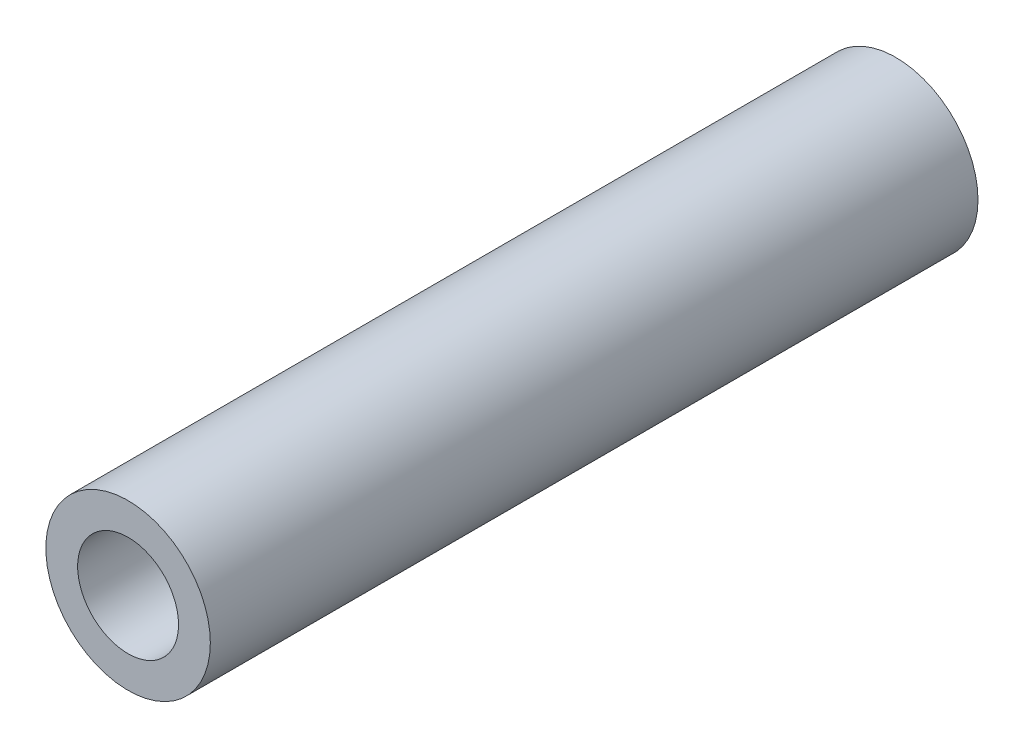
ISO-10303-21;
HEADER;
FILE_DESCRIPTION(('STEP AP214'),'2;1');
FILE_NAME('part.step','',(''),(''),'','','');
FILE_SCHEMA(('AUTOMOTIVE_DESIGN { 1 0 10303 214 1 1 1 1 }'));
ENDSEC;
DATA;
#1=APPLICATION_CONTEXT('core data for automotive mechanical design processes');
#2=APPLICATION_PROTOCOL_DEFINITION('international standard','automotive_design',2000,#1);
#3=PRODUCT_CONTEXT('',#1,'mechanical');
#4=PRODUCT('Part','Part','',(#3));
#5=PRODUCT_RELATED_PRODUCT_CATEGORY('part','',(#4));
#6=PRODUCT_DEFINITION_FORMATION('','',#4);
#7=PRODUCT_DEFINITION_CONTEXT('part definition',#1,'design');
#8=PRODUCT_DEFINITION('design','',#6,#7);
#9=PRODUCT_DEFINITION_SHAPE('','',#8);
#10=(LENGTH_UNIT() NAMED_UNIT(*) SI_UNIT(.MILLI.,.METRE.));
#11=(NAMED_UNIT(*) PLANE_ANGLE_UNIT() SI_UNIT($,.RADIAN.));
#12=(NAMED_UNIT(*) SI_UNIT($,.STERADIAN.) SOLID_ANGLE_UNIT());
#13=UNCERTAINTY_MEASURE_WITH_UNIT(LENGTH_MEASURE(1.E-05),#10,'distance_accuracy_value','');
#14=(GEOMETRIC_REPRESENTATION_CONTEXT(3) GLOBAL_UNCERTAINTY_ASSIGNED_CONTEXT((#13)) GLOBAL_UNIT_ASSIGNED_CONTEXT((#10,
#11,#12)) REPRESENTATION_CONTEXT('',''));
#15=CARTESIAN_POINT('',(0.,0.,0.));
#16=DIRECTION('',(0.,0.,1.));
#17=DIRECTION('',(1.,0.,0.));
#18=AXIS2_PLACEMENT_3D('',#15,#16,#17);
#19=CARTESIAN_POINT('',(0.,0.,11.1125));
#20=DIRECTION('',(0.,0.,1.));
#21=DIRECTION('',(1.,0.,0.));
#22=AXIS2_PLACEMENT_3D('',#19,#20,#21);
#23=PLANE('',#22);
#24=CARTESIAN_POINT('',(0.,0.,11.1125));
#25=DIRECTION('',(0.,0.,1.));
#26=DIRECTION('',(1.,0.,0.));
#27=AXIS2_PLACEMENT_3D('',#24,#25,#26);
#28=CIRCLE('',#27,2.38125);
#29=CARTESIAN_POINT('',(2.38125,0.,11.1125));
#30=VERTEX_POINT('',#29);
#31=EDGE_CURVE('E10',#30,#30,#28,.T.);
#32=ORIENTED_EDGE('',*,*,#31,.T.);
#33=EDGE_LOOP('',(#32));
#34=FACE_BOUND('',#33,.T.);
#35=CARTESIAN_POINT('',(0.,0.,11.1125));
#36=DIRECTION('',(0.,0.,1.));
#37=DIRECTION('',(1.,0.,0.));
#38=AXIS2_PLACEMENT_3D('',#35,#36,#37);
#39=CIRCLE('',#38,1.4605);
#40=CARTESIAN_POINT('',(1.4605,0.,11.1125));
#41=VERTEX_POINT('',#40);
#42=EDGE_CURVE('E43',#41,#41,#39,.T.);
#43=ORIENTED_EDGE('',*,*,#42,.F.);
#44=EDGE_LOOP('',(#43));
#45=FACE_BOUND('',#44,.T.);
#46=ADVANCED_FACE('F32',(#34,#45),#23,.T.);
#47=CARTESIAN_POINT('',(0.,0.,-11.1125));
#48=DIRECTION('',(0.,0.,1.));
#49=DIRECTION('',(1.,0.,0.));
#50=AXIS2_PLACEMENT_3D('',#47,#48,#49);
#51=PLANE('',#50);
#52=CARTESIAN_POINT('',(0.,0.,-11.1125));
#53=DIRECTION('',(0.,0.,1.));
#54=DIRECTION('',(1.,0.,0.));
#55=AXIS2_PLACEMENT_3D('',#52,#53,#54);
#56=CIRCLE('',#55,2.38125);
#57=CARTESIAN_POINT('',(2.38125,0.,-11.1125));
#58=VERTEX_POINT('',#57);
#59=EDGE_CURVE('E36',#58,#58,#56,.T.);
#60=ORIENTED_EDGE('',*,*,#59,.F.);
#61=EDGE_LOOP('',(#60));
#62=FACE_BOUND('',#61,.T.);
#63=CARTESIAN_POINT('',(0.,0.,-11.1125));
#64=DIRECTION('',(0.,0.,1.));
#65=DIRECTION('',(1.,0.,0.));
#66=AXIS2_PLACEMENT_3D('',#63,#64,#65);
#67=CIRCLE('',#66,1.4605);
#68=CARTESIAN_POINT('',(1.4605,0.,-11.1125));
#69=VERTEX_POINT('',#68);
#70=EDGE_CURVE('E45',#69,#69,#67,.T.);
#71=ORIENTED_EDGE('',*,*,#70,.T.);
#72=EDGE_LOOP('',(#71));
#73=FACE_BOUND('',#72,.T.);
#74=ADVANCED_FACE('F55',(#62,#73),#51,.F.);
#75=CARTESIAN_POINT('',(0.,0.,11.1125));
#76=DIRECTION('',(0.,0.,-1.));
#77=DIRECTION('',(-1.,0.,0.));
#78=AXIS2_PLACEMENT_3D('',#75,#76,#77);
#79=CYLINDRICAL_SURFACE('',#78,2.38125);
#80=ORIENTED_EDGE('',*,*,#31,.F.);
#81=EDGE_LOOP('',(#80));
#82=FACE_BOUND('',#81,.T.);
#83=ORIENTED_EDGE('',*,*,#59,.T.);
#84=EDGE_LOOP('',(#83));
#85=FACE_BOUND('',#84,.T.);
#86=ADVANCED_FACE('F34',(#82,#85),#79,.T.);
#87=CARTESIAN_POINT('',(0.,0.,11.1125));
#88=DIRECTION('',(0.,0.,-1.));
#89=DIRECTION('',(-1.,0.,0.));
#90=AXIS2_PLACEMENT_3D('',#87,#88,#89);
#91=CYLINDRICAL_SURFACE('',#90,1.4605);
#92=ORIENTED_EDGE('',*,*,#42,.T.);
#93=EDGE_LOOP('',(#92));
#94=FACE_BOUND('',#93,.T.);
#95=ORIENTED_EDGE('',*,*,#70,.F.);
#96=EDGE_LOOP('',(#95));
#97=FACE_BOUND('',#96,.T.);
#98=ADVANCED_FACE('F51',(#94,#97),#91,.F.);
#99=CLOSED_SHELL('',(#46,#74,#86,#98));
#100=MANIFOLD_SOLID_BREP('B2',#99);
#101=ADVANCED_BREP_SHAPE_REPRESENTATION('',(#18,#100),#14);
#102=SHAPE_DEFINITION_REPRESENTATION(#9,#101);
ENDSEC;
END-ISO-10303-21;
